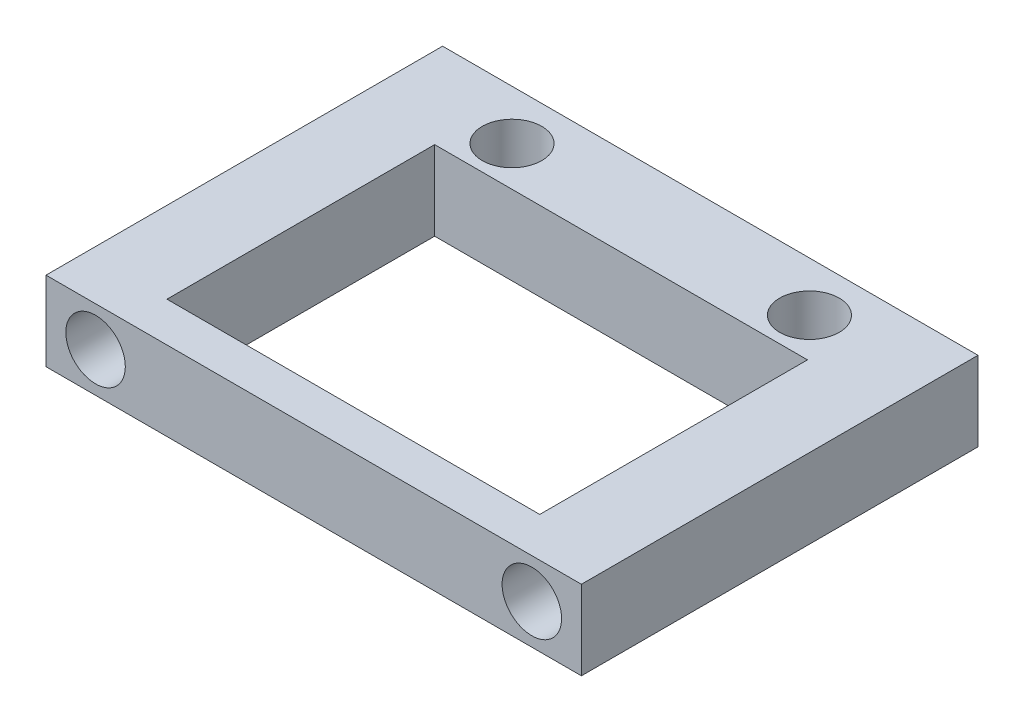
ISO-10303-21;
HEADER;
FILE_DESCRIPTION(('STEP AP214'),'2;1');
FILE_NAME('part.step','',(''),(''),'','','');
FILE_SCHEMA(('AUTOMOTIVE_DESIGN { 1 0 10303 214 1 1 1 1 }'));
ENDSEC;
DATA;
#1=APPLICATION_CONTEXT('core data for automotive mechanical design processes');
#2=APPLICATION_PROTOCOL_DEFINITION('international standard','automotive_design',2000,#1);
#3=PRODUCT_CONTEXT('',#1,'mechanical');
#4=PRODUCT('Part','Part','',(#3));
#5=PRODUCT_RELATED_PRODUCT_CATEGORY('part','',(#4));
#6=PRODUCT_DEFINITION_FORMATION('','',#4);
#7=PRODUCT_DEFINITION_CONTEXT('part definition',#1,'design');
#8=PRODUCT_DEFINITION('design','',#6,#7);
#9=PRODUCT_DEFINITION_SHAPE('','',#8);
#10=(LENGTH_UNIT() NAMED_UNIT(*) SI_UNIT(.MILLI.,.METRE.));
#11=(NAMED_UNIT(*) PLANE_ANGLE_UNIT() SI_UNIT($,.RADIAN.));
#12=(NAMED_UNIT(*) SI_UNIT($,.STERADIAN.) SOLID_ANGLE_UNIT());
#13=UNCERTAINTY_MEASURE_WITH_UNIT(LENGTH_MEASURE(1.E-05),#10,'distance_accuracy_value','');
#14=(GEOMETRIC_REPRESENTATION_CONTEXT(3) GLOBAL_UNCERTAINTY_ASSIGNED_CONTEXT((#13)) GLOBAL_UNIT_ASSIGNED_CONTEXT((#10,
#11,#12)) REPRESENTATION_CONTEXT('',''));
#15=CARTESIAN_POINT('',(0.,0.,0.));
#16=DIRECTION('',(0.,0.,1.));
#17=DIRECTION('',(1.,0.,0.));
#18=AXIS2_PLACEMENT_3D('',#15,#16,#17);
#19=CARTESIAN_POINT('',(0.,4.,0.));
#20=DIRECTION('',(0.,-1.,0.));
#21=DIRECTION('',(0.,0.,-1.));
#22=AXIS2_PLACEMENT_3D('',#19,#20,#21);
#23=PLANE('',#22);
#24=CARTESIAN_POINT('',(7.5,4.,-8.75));
#25=DIRECTION('',(0.,1.,0.));
#26=DIRECTION('',(0.,0.,-1.));
#27=AXIS2_PLACEMENT_3D('',#24,#25,#26);
#28=CIRCLE('',#27,1.5);
#29=CARTESIAN_POINT('',(7.5,4.,-10.25));
#30=VERTEX_POINT('',#29);
#31=EDGE_CURVE('E137',#30,#30,#28,.T.);
#32=ORIENTED_EDGE('',*,*,#31,.F.);
#33=EDGE_LOOP('',(#32));
#34=FACE_BOUND('',#33,.T.);
#35=CARTESIAN_POINT('',(-7.5,4.,-8.75));
#36=DIRECTION('',(0.,1.,0.));
#37=DIRECTION('',(0.,0.,1.));
#38=AXIS2_PLACEMENT_3D('',#35,#36,#37);
#39=CIRCLE('',#38,1.5);
#40=CARTESIAN_POINT('',(-7.5,4.,-7.25));
#41=VERTEX_POINT('',#40);
#42=EDGE_CURVE('E143',#41,#41,#39,.T.);
#43=ORIENTED_EDGE('',*,*,#42,.F.);
#44=EDGE_LOOP('',(#43));
#45=FACE_BOUND('',#44,.T.);
#46=DIRECTION('',(0.,0.,-1.));
#47=VECTOR('',#46,1.);
#48=CARTESIAN_POINT('',(13.5,4.,8.75));
#49=LINE('',#48,#47);
#50=CARTESIAN_POINT('',(13.5,4.,8.75));
#51=VERTEX_POINT('',#50);
#52=CARTESIAN_POINT('',(13.5,4.,-11.25));
#53=VERTEX_POINT('',#52);
#54=EDGE_CURVE('E149',#51,#53,#49,.T.);
#55=ORIENTED_EDGE('',*,*,#54,.T.);
#56=DIRECTION('',(-1.,0.,0.));
#57=VECTOR('',#56,1.);
#58=CARTESIAN_POINT('',(-13.5,4.,-11.25));
#59=LINE('',#58,#57);
#60=CARTESIAN_POINT('',(-13.5,4.,-11.25));
#61=VERTEX_POINT('',#60);
#62=EDGE_CURVE('E152',#53,#61,#59,.T.);
#63=ORIENTED_EDGE('',*,*,#62,.T.);
#64=DIRECTION('',(0.,0.,1.));
#65=VECTOR('',#64,1.);
#66=CARTESIAN_POINT('',(-13.5,4.,8.75));
#67=LINE('',#66,#65);
#68=CARTESIAN_POINT('',(-13.5,4.,8.75));
#69=VERTEX_POINT('',#68);
#70=EDGE_CURVE('E155',#61,#69,#67,.T.);
#71=ORIENTED_EDGE('',*,*,#70,.T.);
#72=DIRECTION('',(1.,0.,0.));
#73=VECTOR('',#72,1.);
#74=CARTESIAN_POINT('',(-13.5,4.,8.75));
#75=LINE('',#74,#73);
#76=EDGE_CURVE('E157',#69,#51,#75,.T.);
#77=ORIENTED_EDGE('',*,*,#76,.T.);
#78=EDGE_LOOP('',(#55,#63,#71,#77));
#79=FACE_BOUND('',#78,.T.);
#80=DIRECTION('',(0.,0.,-1.));
#81=VECTOR('',#80,1.);
#82=CARTESIAN_POINT('',(9.4,4.,6.75));
#83=LINE('',#82,#81);
#84=CARTESIAN_POINT('',(9.4,4.,6.75));
#85=VERTEX_POINT('',#84);
#86=CARTESIAN_POINT('',(9.4,4.,-6.75));
#87=VERTEX_POINT('',#86);
#88=EDGE_CURVE('E99',#85,#87,#83,.T.);
#89=ORIENTED_EDGE('',*,*,#88,.F.);
#90=DIRECTION('',(1.,0.,0.));
#91=VECTOR('',#90,1.);
#92=CARTESIAN_POINT('',(-9.4,4.,6.75));
#93=LINE('',#92,#91);
#94=CARTESIAN_POINT('',(-9.4,4.,6.75));
#95=VERTEX_POINT('',#94);
#96=EDGE_CURVE('E121',#95,#85,#93,.T.);
#97=ORIENTED_EDGE('',*,*,#96,.F.);
#98=DIRECTION('',(0.,0.,1.));
#99=VECTOR('',#98,1.);
#100=CARTESIAN_POINT('',(-9.4,4.,6.75));
#101=LINE('',#100,#99);
#102=CARTESIAN_POINT('',(-9.4,4.,-6.75));
#103=VERTEX_POINT('',#102);
#104=EDGE_CURVE('E119',#103,#95,#101,.T.);
#105=ORIENTED_EDGE('',*,*,#104,.F.);
#106=DIRECTION('',(-1.,0.,0.));
#107=VECTOR('',#106,1.);
#108=CARTESIAN_POINT('',(-9.4,4.,-6.75));
#109=LINE('',#108,#107);
#110=EDGE_CURVE('E107',#87,#103,#109,.T.);
#111=ORIENTED_EDGE('',*,*,#110,.F.);
#112=EDGE_LOOP('',(#89,#97,#105,#111));
#113=FACE_BOUND('',#112,.T.);
#114=ADVANCED_FACE('F34',(#34,#45,#79,#113),#23,.F.);
#115=CARTESIAN_POINT('',(0.,0.,0.));
#116=DIRECTION('',(0.,-1.,0.));
#117=DIRECTION('',(0.,0.,-1.));
#118=AXIS2_PLACEMENT_3D('',#115,#116,#117);
#119=PLANE('',#118);
#120=CARTESIAN_POINT('',(-7.5,0.,-8.75));
#121=DIRECTION('',(0.,1.,0.));
#122=DIRECTION('',(0.,0.,1.));
#123=AXIS2_PLACEMENT_3D('',#120,#121,#122);
#124=CIRCLE('',#123,1.5);
#125=CARTESIAN_POINT('',(-7.5,0.,-7.25));
#126=VERTEX_POINT('',#125);
#127=EDGE_CURVE('E140',#126,#126,#124,.T.);
#128=ORIENTED_EDGE('',*,*,#127,.T.);
#129=EDGE_LOOP('',(#128));
#130=FACE_BOUND('',#129,.T.);
#131=DIRECTION('',(0.,0.,-1.));
#132=VECTOR('',#131,1.);
#133=CARTESIAN_POINT('',(13.5,0.,8.75));
#134=LINE('',#133,#132);
#135=CARTESIAN_POINT('',(13.5,0.,8.75));
#136=VERTEX_POINT('',#135);
#137=CARTESIAN_POINT('',(13.5,0.,-11.25));
#138=VERTEX_POINT('',#137);
#139=EDGE_CURVE('E146',#136,#138,#134,.T.);
#140=ORIENTED_EDGE('',*,*,#139,.F.);
#141=DIRECTION('',(1.,0.,0.));
#142=VECTOR('',#141,1.);
#143=CARTESIAN_POINT('',(-13.5,0.,8.75));
#144=LINE('',#143,#142);
#145=CARTESIAN_POINT('',(-13.5,0.,8.75));
#146=VERTEX_POINT('',#145);
#147=EDGE_CURVE('E153',#146,#136,#144,.T.);
#148=ORIENTED_EDGE('',*,*,#147,.F.);
#149=DIRECTION('',(0.,0.,1.));
#150=VECTOR('',#149,1.);
#151=CARTESIAN_POINT('',(-13.5,0.,8.75));
#152=LINE('',#151,#150);
#153=CARTESIAN_POINT('',(-13.5,0.,-11.25));
#154=VERTEX_POINT('',#153);
#155=EDGE_CURVE('E164',#154,#146,#152,.T.);
#156=ORIENTED_EDGE('',*,*,#155,.F.);
#157=DIRECTION('',(-1.,0.,0.));
#158=VECTOR('',#157,1.);
#159=CARTESIAN_POINT('',(-13.5,0.,-11.25));
#160=LINE('',#159,#158);
#161=EDGE_CURVE('E162',#138,#154,#160,.T.);
#162=ORIENTED_EDGE('',*,*,#161,.F.);
#163=EDGE_LOOP('',(#140,#148,#156,#162));
#164=FACE_BOUND('',#163,.T.);
#165=CARTESIAN_POINT('',(7.5,0.,-8.75));
#166=DIRECTION('',(0.,1.,0.));
#167=DIRECTION('',(0.,0.,-1.));
#168=AXIS2_PLACEMENT_3D('',#165,#166,#167);
#169=CIRCLE('',#168,1.5);
#170=CARTESIAN_POINT('',(7.5,0.,-10.25));
#171=VERTEX_POINT('',#170);
#172=EDGE_CURVE('E115',#171,#171,#169,.T.);
#173=ORIENTED_EDGE('',*,*,#172,.T.);
#174=EDGE_LOOP('',(#173));
#175=FACE_BOUND('',#174,.T.);
#176=DIRECTION('',(1.,0.,0.));
#177=VECTOR('',#176,1.);
#178=CARTESIAN_POINT('',(-9.4,0.,6.75));
#179=LINE('',#178,#177);
#180=CARTESIAN_POINT('',(-9.4,0.,6.75));
#181=VERTEX_POINT('',#180);
#182=CARTESIAN_POINT('',(9.4,0.,6.75));
#183=VERTEX_POINT('',#182);
#184=EDGE_CURVE('E108',#181,#183,#179,.T.);
#185=ORIENTED_EDGE('',*,*,#184,.T.);
#186=DIRECTION('',(0.,0.,-1.));
#187=VECTOR('',#186,1.);
#188=CARTESIAN_POINT('',(9.4,0.,6.75));
#189=LINE('',#188,#187);
#190=CARTESIAN_POINT('',(9.4,0.,-6.75));
#191=VERTEX_POINT('',#190);
#192=EDGE_CURVE('E57',#183,#191,#189,.T.);
#193=ORIENTED_EDGE('',*,*,#192,.T.);
#194=DIRECTION('',(-1.,0.,0.));
#195=VECTOR('',#194,1.);
#196=CARTESIAN_POINT('',(-9.4,0.,-6.75));
#197=LINE('',#196,#195);
#198=CARTESIAN_POINT('',(-9.4,0.,-6.75));
#199=VERTEX_POINT('',#198);
#200=EDGE_CURVE('E114',#191,#199,#197,.T.);
#201=ORIENTED_EDGE('',*,*,#200,.T.);
#202=DIRECTION('',(0.,0.,1.));
#203=VECTOR('',#202,1.);
#204=CARTESIAN_POINT('',(-9.4,0.,6.75));
#205=LINE('',#204,#203);
#206=EDGE_CURVE('E129',#199,#181,#205,.T.);
#207=ORIENTED_EDGE('',*,*,#206,.T.);
#208=EDGE_LOOP('',(#185,#193,#201,#207));
#209=FACE_BOUND('',#208,.T.);
#210=ADVANCED_FACE('F182',(#130,#164,#175,#209),#119,.T.);
#211=CARTESIAN_POINT('',(13.5,4.,8.75));
#212=DIRECTION('',(-1.,0.,0.));
#213=DIRECTION('',(0.,0.,1.));
#214=AXIS2_PLACEMENT_3D('',#211,#212,#213);
#215=PLANE('',#214);
#216=ORIENTED_EDGE('',*,*,#139,.T.);
#217=DIRECTION('',(0.,-1.,0.));
#218=VECTOR('',#217,1.);
#219=CARTESIAN_POINT('',(13.5,4.,-11.25));
#220=LINE('',#219,#218);
#221=EDGE_CURVE('E11',#53,#138,#220,.T.);
#222=ORIENTED_EDGE('',*,*,#221,.F.);
#223=ORIENTED_EDGE('',*,*,#54,.F.);
#224=DIRECTION('',(0.,-1.,0.));
#225=VECTOR('',#224,1.);
#226=CARTESIAN_POINT('',(13.5,4.,8.75));
#227=LINE('',#226,#225);
#228=EDGE_CURVE('E159',#51,#136,#227,.T.);
#229=ORIENTED_EDGE('',*,*,#228,.T.);
#230=EDGE_LOOP('',(#216,#222,#223,#229));
#231=FACE_BOUND('',#230,.T.);
#232=ADVANCED_FACE('F36',(#231),#215,.F.);
#233=CARTESIAN_POINT('',(-13.5,4.,-11.25));
#234=DIRECTION('',(0.,0.,1.));
#235=DIRECTION('',(1.,0.,0.));
#236=AXIS2_PLACEMENT_3D('',#233,#234,#235);
#237=PLANE('',#236);
#238=CARTESIAN_POINT('',(-11.,2.,-11.25));
#239=DIRECTION('',(0.,0.,-1.));
#240=DIRECTION('',(-1.,0.,0.));
#241=AXIS2_PLACEMENT_3D('',#238,#239,#240);
#242=CIRCLE('',#241,1.5);
#243=CARTESIAN_POINT('',(-12.5,2.,-11.25));
#244=VERTEX_POINT('',#243);
#245=EDGE_CURVE('E239',#244,#244,#242,.T.);
#246=ORIENTED_EDGE('',*,*,#245,.F.);
#247=EDGE_LOOP('',(#246));
#248=FACE_BOUND('',#247,.T.);
#249=CARTESIAN_POINT('',(11.,2.,-11.25));
#250=DIRECTION('',(0.,0.,-1.));
#251=DIRECTION('',(-1.,0.,0.));
#252=AXIS2_PLACEMENT_3D('',#249,#250,#251);
#253=CIRCLE('',#252,1.5);
#254=CARTESIAN_POINT('',(9.5,2.,-11.25));
#255=VERTEX_POINT('',#254);
#256=EDGE_CURVE('E244',#255,#255,#253,.T.);
#257=ORIENTED_EDGE('',*,*,#256,.F.);
#258=EDGE_LOOP('',(#257));
#259=FACE_BOUND('',#258,.T.);
#260=ORIENTED_EDGE('',*,*,#161,.T.);
#261=DIRECTION('',(0.,-1.,0.));
#262=VECTOR('',#261,1.);
#263=CARTESIAN_POINT('',(-13.5,4.,-11.25));
#264=LINE('',#263,#262);
#265=EDGE_CURVE('E42',#61,#154,#264,.T.);
#266=ORIENTED_EDGE('',*,*,#265,.F.);
#267=ORIENTED_EDGE('',*,*,#62,.F.);
#268=ORIENTED_EDGE('',*,*,#221,.T.);
#269=EDGE_LOOP('',(#260,#266,#267,#268));
#270=FACE_BOUND('',#269,.T.);
#271=ADVANCED_FACE('F192',(#248,#259,#270),#237,.F.);
#272=CARTESIAN_POINT('',(-13.5,4.,8.75));
#273=DIRECTION('',(1.,0.,0.));
#274=DIRECTION('',(0.,0.,-1.));
#275=AXIS2_PLACEMENT_3D('',#272,#273,#274);
#276=PLANE('',#275);
#277=ORIENTED_EDGE('',*,*,#155,.T.);
#278=DIRECTION('',(0.,-1.,0.));
#279=VECTOR('',#278,1.);
#280=CARTESIAN_POINT('',(-13.5,4.,8.75));
#281=LINE('',#280,#279);
#282=EDGE_CURVE('E169',#69,#146,#281,.T.);
#283=ORIENTED_EDGE('',*,*,#282,.F.);
#284=ORIENTED_EDGE('',*,*,#70,.F.);
#285=ORIENTED_EDGE('',*,*,#265,.T.);
#286=EDGE_LOOP('',(#277,#283,#284,#285));
#287=FACE_BOUND('',#286,.T.);
#288=ADVANCED_FACE('F176',(#287),#276,.F.);
#289=CARTESIAN_POINT('',(-13.5,4.,8.75));
#290=DIRECTION('',(0.,0.,-1.));
#291=DIRECTION('',(-1.,0.,0.));
#292=AXIS2_PLACEMENT_3D('',#289,#290,#291);
#293=PLANE('',#292);
#294=CARTESIAN_POINT('',(11.,2.,8.75));
#295=DIRECTION('',(0.,0.,1.));
#296=DIRECTION('',(1.,0.,0.));
#297=AXIS2_PLACEMENT_3D('',#294,#295,#296);
#298=CIRCLE('',#297,1.5);
#299=CARTESIAN_POINT('',(12.5,2.,8.75));
#300=VERTEX_POINT('',#299);
#301=EDGE_CURVE('E226',#300,#300,#298,.T.);
#302=ORIENTED_EDGE('',*,*,#301,.F.);
#303=EDGE_LOOP('',(#302));
#304=FACE_BOUND('',#303,.T.);
#305=CARTESIAN_POINT('',(-11.,2.,8.75));
#306=DIRECTION('',(0.,0.,1.));
#307=DIRECTION('',(1.,0.,0.));
#308=AXIS2_PLACEMENT_3D('',#305,#306,#307);
#309=CIRCLE('',#308,1.5);
#310=CARTESIAN_POINT('',(-9.5,2.,8.75));
#311=VERTEX_POINT('',#310);
#312=EDGE_CURVE('E229',#311,#311,#309,.T.);
#313=ORIENTED_EDGE('',*,*,#312,.F.);
#314=EDGE_LOOP('',(#313));
#315=FACE_BOUND('',#314,.T.);
#316=ORIENTED_EDGE('',*,*,#147,.T.);
#317=ORIENTED_EDGE('',*,*,#228,.F.);
#318=ORIENTED_EDGE('',*,*,#76,.F.);
#319=ORIENTED_EDGE('',*,*,#282,.T.);
#320=EDGE_LOOP('',(#316,#317,#318,#319));
#321=FACE_BOUND('',#320,.T.);
#322=ADVANCED_FACE('F186',(#304,#315,#321),#293,.F.);
#323=CARTESIAN_POINT('',(-7.5,4.,-8.75));
#324=DIRECTION('',(0.,-1.,0.));
#325=DIRECTION('',(0.,0.,-1.));
#326=AXIS2_PLACEMENT_3D('',#323,#324,#325);
#327=CYLINDRICAL_SURFACE('',#326,1.5);
#328=ORIENTED_EDGE('',*,*,#42,.T.);
#329=EDGE_LOOP('',(#328));
#330=FACE_BOUND('',#329,.T.);
#331=ORIENTED_EDGE('',*,*,#127,.F.);
#332=EDGE_LOOP('',(#331));
#333=FACE_BOUND('',#332,.T.);
#334=ADVANCED_FACE('F213',(#330,#333),#327,.F.);
#335=CARTESIAN_POINT('',(7.5,4.,-8.75));
#336=DIRECTION('',(0.,-1.,0.));
#337=DIRECTION('',(0.,0.,-1.));
#338=AXIS2_PLACEMENT_3D('',#335,#336,#337);
#339=CYLINDRICAL_SURFACE('',#338,1.5);
#340=ORIENTED_EDGE('',*,*,#31,.T.);
#341=EDGE_LOOP('',(#340));
#342=FACE_BOUND('',#341,.T.);
#343=ORIENTED_EDGE('',*,*,#172,.F.);
#344=EDGE_LOOP('',(#343));
#345=FACE_BOUND('',#344,.T.);
#346=ADVANCED_FACE('F221',(#342,#345),#339,.F.);
#347=CARTESIAN_POINT('',(9.4,4.,6.75));
#348=DIRECTION('',(-1.,0.,0.));
#349=DIRECTION('',(0.,0.,1.));
#350=AXIS2_PLACEMENT_3D('',#347,#348,#349);
#351=PLANE('',#350);
#352=ORIENTED_EDGE('',*,*,#192,.F.);
#353=DIRECTION('',(0.,-1.,0.));
#354=VECTOR('',#353,1.);
#355=CARTESIAN_POINT('',(9.4,4.,6.75));
#356=LINE('',#355,#354);
#357=EDGE_CURVE('E103',#85,#183,#356,.T.);
#358=ORIENTED_EDGE('',*,*,#357,.F.);
#359=ORIENTED_EDGE('',*,*,#88,.T.);
#360=DIRECTION('',(0.,-1.,0.));
#361=VECTOR('',#360,1.);
#362=CARTESIAN_POINT('',(9.4,4.,-6.75));
#363=LINE('',#362,#361);
#364=EDGE_CURVE('E102',#87,#191,#363,.T.);
#365=ORIENTED_EDGE('',*,*,#364,.T.);
#366=EDGE_LOOP('',(#352,#358,#359,#365));
#367=FACE_BOUND('',#366,.T.);
#368=ADVANCED_FACE('F101',(#367),#351,.T.);
#369=CARTESIAN_POINT('',(-9.4,4.,-6.75));
#370=DIRECTION('',(0.,0.,1.));
#371=DIRECTION('',(1.,0.,0.));
#372=AXIS2_PLACEMENT_3D('',#369,#370,#371);
#373=PLANE('',#372);
#374=ORIENTED_EDGE('',*,*,#200,.F.);
#375=ORIENTED_EDGE('',*,*,#364,.F.);
#376=ORIENTED_EDGE('',*,*,#110,.T.);
#377=DIRECTION('',(0.,-1.,0.));
#378=VECTOR('',#377,1.);
#379=CARTESIAN_POINT('',(-9.4,4.,-6.75));
#380=LINE('',#379,#378);
#381=EDGE_CURVE('E116',#103,#199,#380,.T.);
#382=ORIENTED_EDGE('',*,*,#381,.T.);
#383=EDGE_LOOP('',(#374,#375,#376,#382));
#384=FACE_BOUND('',#383,.T.);
#385=ADVANCED_FACE('F111',(#384),#373,.T.);
#386=CARTESIAN_POINT('',(-9.4,4.,6.75));
#387=DIRECTION('',(1.,0.,0.));
#388=DIRECTION('',(0.,0.,-1.));
#389=AXIS2_PLACEMENT_3D('',#386,#387,#388);
#390=PLANE('',#389);
#391=ORIENTED_EDGE('',*,*,#206,.F.);
#392=ORIENTED_EDGE('',*,*,#381,.F.);
#393=ORIENTED_EDGE('',*,*,#104,.T.);
#394=DIRECTION('',(0.,-1.,0.));
#395=VECTOR('',#394,1.);
#396=CARTESIAN_POINT('',(-9.4,4.,6.75));
#397=LINE('',#396,#395);
#398=EDGE_CURVE('E49',#95,#181,#397,.T.);
#399=ORIENTED_EDGE('',*,*,#398,.T.);
#400=EDGE_LOOP('',(#391,#392,#393,#399));
#401=FACE_BOUND('',#400,.T.);
#402=ADVANCED_FACE('F291',(#401),#390,.T.);
#403=CARTESIAN_POINT('',(-9.4,4.,6.75));
#404=DIRECTION('',(0.,0.,-1.));
#405=DIRECTION('',(-1.,0.,0.));
#406=AXIS2_PLACEMENT_3D('',#403,#404,#405);
#407=PLANE('',#406);
#408=ORIENTED_EDGE('',*,*,#184,.F.);
#409=ORIENTED_EDGE('',*,*,#398,.F.);
#410=ORIENTED_EDGE('',*,*,#96,.T.);
#411=ORIENTED_EDGE('',*,*,#357,.T.);
#412=EDGE_LOOP('',(#408,#409,#410,#411));
#413=FACE_BOUND('',#412,.T.);
#414=ADVANCED_FACE('F287',(#413),#407,.T.);
#415=CARTESIAN_POINT('',(11.,2.,-5.25));
#416=DIRECTION('',(0.,0.,-1.));
#417=DIRECTION('',(-1.,0.,0.));
#418=AXIS2_PLACEMENT_3D('',#415,#416,#417);
#419=CYLINDRICAL_SURFACE('',#418,1.5);
#420=CARTESIAN_POINT('',(11.,2.,-5.25));
#421=DIRECTION('',(0.,0.,-1.));
#422=DIRECTION('',(-1.,0.,0.));
#423=AXIS2_PLACEMENT_3D('',#420,#421,#422);
#424=CIRCLE('',#423,1.5);
#425=CARTESIAN_POINT('',(9.5,2.,-5.25));
#426=VERTEX_POINT('',#425);
#427=EDGE_CURVE('E242',#426,#426,#424,.T.);
#428=ORIENTED_EDGE('',*,*,#427,.F.);
#429=EDGE_LOOP('',(#428));
#430=FACE_BOUND('',#429,.T.);
#431=ORIENTED_EDGE('',*,*,#256,.T.);
#432=EDGE_LOOP('',(#431));
#433=FACE_BOUND('',#432,.T.);
#434=ADVANCED_FACE('F283',(#430,#433),#419,.F.);
#435=CARTESIAN_POINT('',(11.,2.,-5.25));
#436=DIRECTION('',(0.,0.,-1.));
#437=DIRECTION('',(-1.,0.,0.));
#438=AXIS2_PLACEMENT_3D('',#435,#436,#437);
#439=PLANE('',#438);
#440=ORIENTED_EDGE('',*,*,#427,.T.);
#441=EDGE_LOOP('',(#440));
#442=FACE_BOUND('',#441,.T.);
#443=ADVANCED_FACE('F279',(#442),#439,.T.);
#444=CARTESIAN_POINT('',(-11.,2.,-5.25));
#445=DIRECTION('',(0.,0.,-1.));
#446=DIRECTION('',(-1.,0.,0.));
#447=AXIS2_PLACEMENT_3D('',#444,#445,#446);
#448=CYLINDRICAL_SURFACE('',#447,1.5);
#449=CARTESIAN_POINT('',(-11.,2.,-5.25));
#450=DIRECTION('',(0.,0.,-1.));
#451=DIRECTION('',(-1.,0.,0.));
#452=AXIS2_PLACEMENT_3D('',#449,#450,#451);
#453=CIRCLE('',#452,1.5);
#454=CARTESIAN_POINT('',(-12.5,2.,-5.25));
#455=VERTEX_POINT('',#454);
#456=EDGE_CURVE('E127',#455,#455,#453,.T.);
#457=ORIENTED_EDGE('',*,*,#456,.F.);
#458=EDGE_LOOP('',(#457));
#459=FACE_BOUND('',#458,.T.);
#460=ORIENTED_EDGE('',*,*,#245,.T.);
#461=EDGE_LOOP('',(#460));
#462=FACE_BOUND('',#461,.T.);
#463=ADVANCED_FACE('F275',(#459,#462),#448,.F.);
#464=CARTESIAN_POINT('',(-11.,2.,-5.25));
#465=DIRECTION('',(0.,0.,-1.));
#466=DIRECTION('',(-1.,0.,0.));
#467=AXIS2_PLACEMENT_3D('',#464,#465,#466);
#468=PLANE('',#467);
#469=ORIENTED_EDGE('',*,*,#456,.T.);
#470=EDGE_LOOP('',(#469));
#471=FACE_BOUND('',#470,.T.);
#472=ADVANCED_FACE('F271',(#471),#468,.T.);
#473=CARTESIAN_POINT('',(-11.,2.,2.75));
#474=DIRECTION('',(0.,0.,1.));
#475=DIRECTION('',(1.,0.,0.));
#476=AXIS2_PLACEMENT_3D('',#473,#474,#475);
#477=CYLINDRICAL_SURFACE('',#476,1.5);
#478=CARTESIAN_POINT('',(-11.,2.,2.75));
#479=DIRECTION('',(0.,0.,1.));
#480=DIRECTION('',(1.,0.,0.));
#481=AXIS2_PLACEMENT_3D('',#478,#479,#480);
#482=CIRCLE('',#481,1.5);
#483=CARTESIAN_POINT('',(-9.5,2.,2.75));
#484=VERTEX_POINT('',#483);
#485=EDGE_CURVE('E231',#484,#484,#482,.T.);
#486=ORIENTED_EDGE('',*,*,#485,.F.);
#487=EDGE_LOOP('',(#486));
#488=FACE_BOUND('',#487,.T.);
#489=ORIENTED_EDGE('',*,*,#312,.T.);
#490=EDGE_LOOP('',(#489));
#491=FACE_BOUND('',#490,.T.);
#492=ADVANCED_FACE('F265',(#488,#491),#477,.F.);
#493=CARTESIAN_POINT('',(-11.,2.,2.75));
#494=DIRECTION('',(0.,0.,1.));
#495=DIRECTION('',(1.,0.,0.));
#496=AXIS2_PLACEMENT_3D('',#493,#494,#495);
#497=PLANE('',#496);
#498=ORIENTED_EDGE('',*,*,#485,.T.);
#499=EDGE_LOOP('',(#498));
#500=FACE_BOUND('',#499,.T.);
#501=ADVANCED_FACE('F257',(#500),#497,.T.);
#502=CARTESIAN_POINT('',(11.,2.,2.75));
#503=DIRECTION('',(0.,0.,1.));
#504=DIRECTION('',(1.,0.,0.));
#505=AXIS2_PLACEMENT_3D('',#502,#503,#504);
#506=CYLINDRICAL_SURFACE('',#505,1.5);
#507=CARTESIAN_POINT('',(11.,2.,2.75));
#508=DIRECTION('',(0.,0.,1.));
#509=DIRECTION('',(1.,0.,0.));
#510=AXIS2_PLACEMENT_3D('',#507,#508,#509);
#511=CIRCLE('',#510,1.5);
#512=CARTESIAN_POINT('',(12.5,2.,2.75));
#513=VERTEX_POINT('',#512);
#514=EDGE_CURVE('E246',#513,#513,#511,.T.);
#515=ORIENTED_EDGE('',*,*,#514,.F.);
#516=EDGE_LOOP('',(#515));
#517=FACE_BOUND('',#516,.T.);
#518=ORIENTED_EDGE('',*,*,#301,.T.);
#519=EDGE_LOOP('',(#518));
#520=FACE_BOUND('',#519,.T.);
#521=ADVANCED_FACE('F254',(#517,#520),#506,.F.);
#522=CARTESIAN_POINT('',(11.,2.,2.75));
#523=DIRECTION('',(0.,0.,1.));
#524=DIRECTION('',(1.,0.,0.));
#525=AXIS2_PLACEMENT_3D('',#522,#523,#524);
#526=PLANE('',#525);
#527=ORIENTED_EDGE('',*,*,#514,.T.);
#528=EDGE_LOOP('',(#527));
#529=FACE_BOUND('',#528,.T.);
#530=ADVANCED_FACE('F256',(#529),#526,.T.);
#531=CLOSED_SHELL('',(#114,#210,#232,#271,#288,#322,#334,#346,#368,#385,#402,#414,#434,#443,
#463,#472,#492,#501,#521,#530));
#532=MANIFOLD_SOLID_BREP('B2',#531);
#533=ADVANCED_BREP_SHAPE_REPRESENTATION('',(#18,#532),#14);
#534=SHAPE_DEFINITION_REPRESENTATION(#9,#533);
ENDSEC;
END-ISO-10303-21;
